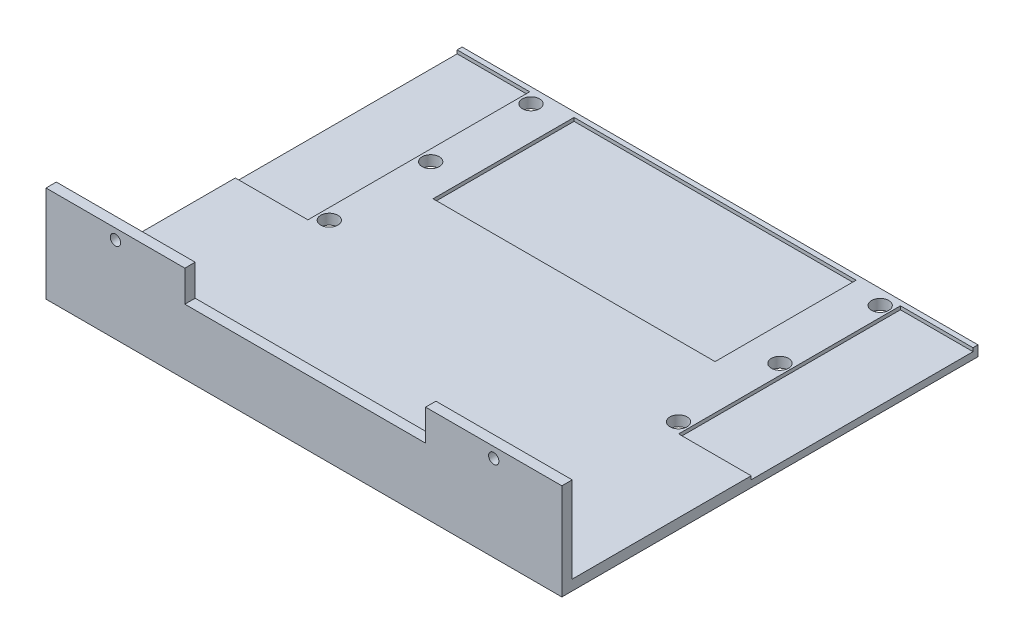
ISO-10303-21;
HEADER;
FILE_DESCRIPTION(('STEP AP214'),'2;1');
FILE_NAME('part.step','',(''),(''),'','','');
FILE_SCHEMA(('AUTOMOTIVE_DESIGN { 1 0 10303 214 1 1 1 1 }'));
ENDSEC;
DATA;
#1=APPLICATION_CONTEXT('core data for automotive mechanical design processes');
#2=APPLICATION_PROTOCOL_DEFINITION('international standard','automotive_design',2000,#1);
#3=PRODUCT_CONTEXT('',#1,'mechanical');
#4=PRODUCT('Part','Part','',(#3));
#5=PRODUCT_RELATED_PRODUCT_CATEGORY('part','',(#4));
#6=PRODUCT_DEFINITION_FORMATION('','',#4);
#7=PRODUCT_DEFINITION_CONTEXT('part definition',#1,'design');
#8=PRODUCT_DEFINITION('design','',#6,#7);
#9=PRODUCT_DEFINITION_SHAPE('','',#8);
#10=(LENGTH_UNIT() NAMED_UNIT(*) SI_UNIT(.MILLI.,.METRE.));
#11=(NAMED_UNIT(*) PLANE_ANGLE_UNIT() SI_UNIT($,.RADIAN.));
#12=(NAMED_UNIT(*) SI_UNIT($,.STERADIAN.) SOLID_ANGLE_UNIT());
#13=UNCERTAINTY_MEASURE_WITH_UNIT(LENGTH_MEASURE(1.E-05),#10,'distance_accuracy_value','');
#14=(GEOMETRIC_REPRESENTATION_CONTEXT(3) GLOBAL_UNCERTAINTY_ASSIGNED_CONTEXT((#13)) GLOBAL_UNIT_ASSIGNED_CONTEXT((#10,
#11,#12)) REPRESENTATION_CONTEXT('',''));
#15=CARTESIAN_POINT('',(0.,0.,0.));
#16=DIRECTION('',(0.,0.,1.));
#17=DIRECTION('',(1.,0.,0.));
#18=AXIS2_PLACEMENT_3D('',#15,#16,#17);
#19=CARTESIAN_POINT('',(-150.,30.9340002340272,70.2188789689777));
#20=DIRECTION('',(0.,-1.,0.));
#21=DIRECTION('',(0.,0.,-1.));
#22=AXIS2_PLACEMENT_3D('',#19,#20,#21);
#23=PLANE('',#22);
#24=DIRECTION('',(1.,0.,0.));
#25=VECTOR('',#24,1.);
#26=CARTESIAN_POINT('',(-150.,30.9340002340272,67.2188789689777));
#27=LINE('',#26,#25);
#28=CARTESIAN_POINT('',(-39.6260341679175,30.9340002340272,67.2188789689777));
#29=VERTEX_POINT('',#28);
#30=CARTESIAN_POINT('',(0.,30.9340002340272,67.2188789689777));
#31=VERTEX_POINT('',#30);
#32=EDGE_CURVE('E405',#29,#31,#27,.T.);
#33=ORIENTED_EDGE('',*,*,#32,.F.);
#34=DIRECTION('',(0.,0.,1.));
#35=VECTOR('',#34,1.);
#36=CARTESIAN_POINT('',(-39.6260341679175,30.9340002340272,67.2188789689777));
#37=LINE('',#36,#35);
#38=CARTESIAN_POINT('',(-39.6260341679175,30.9340002340272,70.2188789689777));
#39=VERTEX_POINT('',#38);
#40=EDGE_CURVE('E334',#29,#39,#37,.T.);
#41=ORIENTED_EDGE('',*,*,#40,.T.);
#42=DIRECTION('',(1.,0.,0.));
#43=VECTOR('',#42,1.);
#44=CARTESIAN_POINT('',(-150.,30.9340002340272,70.2188789689777));
#45=LINE('',#44,#43);
#46=CARTESIAN_POINT('',(0.,30.9340002340272,70.2188789689777));
#47=VERTEX_POINT('',#46);
#48=EDGE_CURVE('E410',#39,#47,#45,.T.);
#49=ORIENTED_EDGE('',*,*,#48,.T.);
#50=DIRECTION('',(0.,0.,-1.));
#51=VECTOR('',#50,1.);
#52=CARTESIAN_POINT('',(0.,30.9340002340272,70.2188789689777));
#53=LINE('',#52,#51);
#54=EDGE_CURVE('E395',#47,#31,#53,.T.);
#55=ORIENTED_EDGE('',*,*,#54,.T.);
#56=EDGE_LOOP('',(#33,#41,#49,#55));
#57=FACE_BOUND('',#56,.T.);
#58=ADVANCED_FACE('F39',(#57),#23,.F.);
#59=CARTESIAN_POINT('',(-150.,5.93400023402718,67.2188789689777));
#60=DIRECTION('',(0.,-1.,0.));
#61=DIRECTION('',(0.,0.,-1.));
#62=AXIS2_PLACEMENT_3D('',#59,#60,#61);
#63=PLANE('',#62);
#64=CARTESIAN_POINT('',(-24.1434377354213,5.93400023402718,-46.4824812406044));
#65=DIRECTION('',(0.,1.,0.));
#66=DIRECTION('',(0.,0.,1.));
#67=AXIS2_PLACEMENT_3D('',#64,#65,#66);
#68=CIRCLE('',#67,2.5);
#69=CARTESIAN_POINT('',(-24.1434377354213,5.93400023402718,-43.9824812406044));
#70=VERTEX_POINT('',#69);
#71=EDGE_CURVE('E818',#70,#70,#68,.T.);
#72=ORIENTED_EDGE('',*,*,#71,.F.);
#73=EDGE_LOOP('',(#72));
#74=FACE_BOUND('',#73,.T.);
#75=CARTESIAN_POINT('',(-24.1434377354213,5.93400023402718,-17.3290379042217));
#76=DIRECTION('',(0.,1.,0.));
#77=DIRECTION('',(0.,0.,1.));
#78=AXIS2_PLACEMENT_3D('',#75,#76,#77);
#79=CIRCLE('',#78,2.5);
#80=CARTESIAN_POINT('',(-24.1434377354213,5.93400023402718,-14.8290379042217));
#81=VERTEX_POINT('',#80);
#82=EDGE_CURVE('E826',#81,#81,#79,.T.);
#83=ORIENTED_EDGE('',*,*,#82,.F.);
#84=EDGE_LOOP('',(#83));
#85=FACE_BOUND('',#84,.T.);
#86=CARTESIAN_POINT('',(-125.694598690488,5.93400023402718,-17.3290379042217));
#87=DIRECTION('',(0.,1.,0.));
#88=DIRECTION('',(0.,0.,1.));
#89=AXIS2_PLACEMENT_3D('',#86,#87,#88);
#90=CIRCLE('',#89,2.5);
#91=CARTESIAN_POINT('',(-125.694598690488,5.93400023402718,-14.8290379042217));
#92=VERTEX_POINT('',#91);
#93=EDGE_CURVE('E834',#92,#92,#90,.T.);
#94=ORIENTED_EDGE('',*,*,#93,.F.);
#95=EDGE_LOOP('',(#94));
#96=FACE_BOUND('',#95,.T.);
#97=CARTESIAN_POINT('',(-125.694598690488,5.93400023402718,12.148332580343));
#98=DIRECTION('',(0.,1.,0.));
#99=DIRECTION('',(0.,0.,1.));
#100=AXIS2_PLACEMENT_3D('',#97,#98,#99);
#101=CIRCLE('',#100,2.5);
#102=CARTESIAN_POINT('',(-125.694598690488,5.93400023402718,14.648332580343));
#103=VERTEX_POINT('',#102);
#104=EDGE_CURVE('E810',#103,#103,#101,.T.);
#105=ORIENTED_EDGE('',*,*,#104,.F.);
#106=EDGE_LOOP('',(#105));
#107=FACE_BOUND('',#106,.T.);
#108=CARTESIAN_POINT('',(-125.694598690488,5.93400023402718,-46.4824812406044));
#109=DIRECTION('',(0.,1.,0.));
#110=DIRECTION('',(0.,0.,1.));
#111=AXIS2_PLACEMENT_3D('',#108,#109,#110);
#112=CIRCLE('',#111,2.5);
#113=CARTESIAN_POINT('',(-125.694598690488,5.93400023402718,-43.9824812406044));
#114=VERTEX_POINT('',#113);
#115=EDGE_CURVE('E797',#114,#114,#112,.T.);
#116=ORIENTED_EDGE('',*,*,#115,.F.);
#117=EDGE_LOOP('',(#116));
#118=FACE_BOUND('',#117,.T.);
#119=CARTESIAN_POINT('',(-24.1434377354213,5.93400023402718,12.148332580343));
#120=DIRECTION('',(0.,1.,0.));
#121=DIRECTION('',(0.,0.,1.));
#122=AXIS2_PLACEMENT_3D('',#119,#120,#121);
#123=CIRCLE('',#122,2.5);
#124=CARTESIAN_POINT('',(-24.1434377354213,5.93400023402718,14.648332580343));
#125=VERTEX_POINT('',#124);
#126=EDGE_CURVE('E221',#125,#125,#123,.T.);
#127=ORIENTED_EDGE('',*,*,#126,.F.);
#128=EDGE_LOOP('',(#127));
#129=FACE_BOUND('',#128,.T.);
#130=DIRECTION('',(-1.,0.,0.));
#131=VECTOR('',#130,1.);
#132=CARTESIAN_POINT('',(-116.,5.93400023402718,-49.3311210310222));
#133=LINE('',#132,#131);
#134=CARTESIAN_POINT('',(-34.,5.93400023402718,-49.3311210310223));
#135=VERTEX_POINT('',#134);
#136=CARTESIAN_POINT('',(-116.,5.93400023402718,-49.3311210310222));
#137=VERTEX_POINT('',#136);
#138=EDGE_CURVE('E230',#135,#137,#133,.T.);
#139=ORIENTED_EDGE('',*,*,#138,.F.);
#140=DIRECTION('',(0.,0.,-1.));
#141=VECTOR('',#140,1.);
#142=CARTESIAN_POINT('',(-34.,5.93400023402718,-8.33112103102224));
#143=LINE('',#142,#141);
#144=CARTESIAN_POINT('',(-34.,5.93400023402718,-8.33112103102224));
#145=VERTEX_POINT('',#144);
#146=EDGE_CURVE('E55',#145,#135,#143,.T.);
#147=ORIENTED_EDGE('',*,*,#146,.F.);
#148=DIRECTION('',(1.,0.,0.));
#149=VECTOR('',#148,1.);
#150=CARTESIAN_POINT('',(-116.,5.93400023402718,-8.33112103102224));
#151=LINE('',#150,#149);
#152=CARTESIAN_POINT('',(-116.,5.93400023402718,-8.33112103102224));
#153=VERTEX_POINT('',#152);
#154=EDGE_CURVE('E214',#153,#145,#151,.T.);
#155=ORIENTED_EDGE('',*,*,#154,.F.);
#156=DIRECTION('',(0.,0.,1.));
#157=VECTOR('',#156,1.);
#158=CARTESIAN_POINT('',(-116.,5.93400023402718,-49.3311210310222));
#159=LINE('',#158,#157);
#160=EDGE_CURVE('E218',#137,#153,#159,.T.);
#161=ORIENTED_EDGE('',*,*,#160,.F.);
#162=EDGE_LOOP('',(#139,#147,#155,#161));
#163=FACE_BOUND('',#162,.T.);
#164=DIRECTION('',(0.,0.,-1.));
#165=VECTOR('',#164,1.);
#166=CARTESIAN_POINT('',(-150.,5.93400023402718,67.2188789689777));
#167=LINE('',#166,#165);
#168=CARTESIAN_POINT('',(-150.,5.93400023402718,-49.3311210310222));
#169=VERTEX_POINT('',#168);
#170=CARTESIAN_POINT('',(-150.,5.93400023402718,-50.7811210310223));
#171=VERTEX_POINT('',#170);
#172=EDGE_CURVE('E362',#169,#171,#167,.T.);
#173=ORIENTED_EDGE('',*,*,#172,.F.);
#174=DIRECTION('',(-1.,0.,0.));
#175=VECTOR('',#174,1.);
#176=CARTESIAN_POINT('',(-128.9,5.93400023402718,-49.3311210310222));
#177=LINE('',#176,#175);
#178=CARTESIAN_POINT('',(-128.9,5.93400023402718,-49.3311210310222));
#179=VERTEX_POINT('',#178);
#180=EDGE_CURVE('E260',#179,#169,#177,.T.);
#181=ORIENTED_EDGE('',*,*,#180,.F.);
#182=DIRECTION('',(0.,0.,-1.));
#183=VECTOR('',#182,1.);
#184=CARTESIAN_POINT('',(-128.9,5.93400023402718,15.1688789689778));
#185=LINE('',#184,#183);
#186=CARTESIAN_POINT('',(-128.9,5.93400023402718,15.1688789689778));
#187=VERTEX_POINT('',#186);
#188=EDGE_CURVE('E249',#187,#179,#185,.T.);
#189=ORIENTED_EDGE('',*,*,#188,.F.);
#190=DIRECTION('',(1.,0.,0.));
#191=VECTOR('',#190,1.);
#192=CARTESIAN_POINT('',(-150.,5.93400023402718,15.1688789689778));
#193=LINE('',#192,#191);
#194=CARTESIAN_POINT('',(-150.,5.93400023402718,15.1688789689778));
#195=VERTEX_POINT('',#194);
#196=EDGE_CURVE('E263',#195,#187,#193,.T.);
#197=ORIENTED_EDGE('',*,*,#196,.F.);
#198=CARTESIAN_POINT('',(-150.,5.93400023402718,67.2188789689777));
#199=VERTEX_POINT('',#198);
#200=EDGE_CURVE('E357',#199,#195,#167,.T.);
#201=ORIENTED_EDGE('',*,*,#200,.F.);
#202=DIRECTION('',(1.,0.,0.));
#203=VECTOR('',#202,1.);
#204=CARTESIAN_POINT('',(-150.,5.93400023402718,67.2188789689777));
#205=LINE('',#204,#203);
#206=CARTESIAN_POINT('',(0.,5.93400023402718,67.2188789689777));
#207=VERTEX_POINT('',#206);
#208=EDGE_CURVE('E378',#199,#207,#205,.T.);
#209=ORIENTED_EDGE('',*,*,#208,.T.);
#210=DIRECTION('',(0.,0.,-1.));
#211=VECTOR('',#210,1.);
#212=CARTESIAN_POINT('',(0.,5.93400023402718,67.2188789689777));
#213=LINE('',#212,#211);
#214=CARTESIAN_POINT('',(0.,5.93400023402718,15.1688789689778));
#215=VERTEX_POINT('',#214);
#216=EDGE_CURVE('E379',#207,#215,#213,.T.);
#217=ORIENTED_EDGE('',*,*,#216,.T.);
#218=DIRECTION('',(1.,0.,0.));
#219=VECTOR('',#218,1.);
#220=CARTESIAN_POINT('',(-21.1,5.93400023402718,15.1688789689778));
#221=LINE('',#220,#219);
#222=CARTESIAN_POINT('',(-21.1,5.93400023402718,15.1688789689778));
#223=VERTEX_POINT('',#222);
#224=EDGE_CURVE('E240',#223,#215,#221,.T.);
#225=ORIENTED_EDGE('',*,*,#224,.F.);
#226=DIRECTION('',(0.,0.,1.));
#227=VECTOR('',#226,1.);
#228=CARTESIAN_POINT('',(-21.1,5.93400023402718,-49.3311210310223));
#229=LINE('',#228,#227);
#230=CARTESIAN_POINT('',(-21.1,5.93400023402718,-49.3311210310223));
#231=VERTEX_POINT('',#230);
#232=EDGE_CURVE('E288',#231,#223,#229,.T.);
#233=ORIENTED_EDGE('',*,*,#232,.F.);
#234=DIRECTION('',(-1.,0.,0.));
#235=VECTOR('',#234,1.);
#236=CARTESIAN_POINT('',(0.,5.93400023402718,-49.3311210310222));
#237=LINE('',#236,#235);
#238=CARTESIAN_POINT('',(0.,5.93400023402718,-49.3311210310222));
#239=VERTEX_POINT('',#238);
#240=EDGE_CURVE('E303',#239,#231,#237,.T.);
#241=ORIENTED_EDGE('',*,*,#240,.F.);
#242=CARTESIAN_POINT('',(0.,5.93400023402718,-50.7811210310223));
#243=VERTEX_POINT('',#242);
#244=EDGE_CURVE('E347',#239,#243,#213,.T.);
#245=ORIENTED_EDGE('',*,*,#244,.T.);
#246=DIRECTION('',(1.,0.,0.));
#247=VECTOR('',#246,1.);
#248=CARTESIAN_POINT('',(-150.,5.93400023402718,-50.7811210310223));
#249=LINE('',#248,#247);
#250=EDGE_CURVE('E11',#171,#243,#249,.T.);
#251=ORIENTED_EDGE('',*,*,#250,.F.);
#252=EDGE_LOOP('',(#173,#181,#189,#197,#201,#209,#217,#225,#233,#241,#245,#251));
#253=FACE_BOUND('',#252,.T.);
#254=ADVANCED_FACE('F41',(#74,#85,#96,#107,#118,#129,#163,#253),#63,.F.);
#255=CARTESIAN_POINT('',(-150.,5.93400023402718,-50.7811210310223));
#256=DIRECTION('',(0.,0.,1.));
#257=DIRECTION('',(1.,0.,0.));
#258=AXIS2_PLACEMENT_3D('',#255,#256,#257);
#259=PLANE('',#258);
#260=DIRECTION('',(0.,-1.,0.));
#261=VECTOR('',#260,1.);
#262=CARTESIAN_POINT('',(0.,5.93400023402718,-50.7811210310223));
#263=LINE('',#262,#261);
#264=CARTESIAN_POINT('',(0.,2.93400023402718,-50.7811210310223));
#265=VERTEX_POINT('',#264);
#266=EDGE_CURVE('E383',#243,#265,#263,.T.);
#267=ORIENTED_EDGE('',*,*,#266,.T.);
#268=DIRECTION('',(1.,0.,0.));
#269=VECTOR('',#268,1.);
#270=CARTESIAN_POINT('',(-150.,2.93400023402718,-50.7811210310223));
#271=LINE('',#270,#269);
#272=CARTESIAN_POINT('',(-150.,2.93400023402718,-50.7811210310223));
#273=VERTEX_POINT('',#272);
#274=EDGE_CURVE('E48',#273,#265,#271,.T.);
#275=ORIENTED_EDGE('',*,*,#274,.F.);
#276=DIRECTION('',(0.,-1.,0.));
#277=VECTOR('',#276,1.);
#278=CARTESIAN_POINT('',(-150.,5.93400023402718,-50.7811210310223));
#279=LINE('',#278,#277);
#280=EDGE_CURVE('E361',#171,#273,#279,.T.);
#281=ORIENTED_EDGE('',*,*,#280,.F.);
#282=ORIENTED_EDGE('',*,*,#250,.T.);
#283=EDGE_LOOP('',(#267,#275,#281,#282));
#284=FACE_BOUND('',#283,.T.);
#285=ADVANCED_FACE('F426',(#284),#259,.F.);
#286=CARTESIAN_POINT('',(-150.,2.93400023402718,70.2188789689777));
#287=DIRECTION('',(0.,-1.,0.));
#288=DIRECTION('',(0.,0.,-1.));
#289=AXIS2_PLACEMENT_3D('',#286,#287,#288);
#290=PLANE('',#289);
#291=CARTESIAN_POINT('',(-24.1434377354213,2.93400023402718,-46.4824812406044));
#292=DIRECTION('',(0.,1.,0.));
#293=DIRECTION('',(0.,0.,1.));
#294=AXIS2_PLACEMENT_3D('',#291,#292,#293);
#295=CIRCLE('',#294,2.5);
#296=CARTESIAN_POINT('',(-24.1434377354213,2.93400023402718,-43.9824812406044));
#297=VERTEX_POINT('',#296);
#298=EDGE_CURVE('E814',#297,#297,#295,.T.);
#299=ORIENTED_EDGE('',*,*,#298,.T.);
#300=EDGE_LOOP('',(#299));
#301=FACE_BOUND('',#300,.T.);
#302=CARTESIAN_POINT('',(-24.1434377354213,2.93400023402718,-17.3290379042217));
#303=DIRECTION('',(0.,1.,0.));
#304=DIRECTION('',(0.,0.,1.));
#305=AXIS2_PLACEMENT_3D('',#302,#303,#304);
#306=CIRCLE('',#305,2.5);
#307=CARTESIAN_POINT('',(-24.1434377354213,2.93400023402718,-14.8290379042217));
#308=VERTEX_POINT('',#307);
#309=EDGE_CURVE('E822',#308,#308,#306,.T.);
#310=ORIENTED_EDGE('',*,*,#309,.T.);
#311=EDGE_LOOP('',(#310));
#312=FACE_BOUND('',#311,.T.);
#313=CARTESIAN_POINT('',(-125.694598690488,2.93400023402718,-17.3290379042217));
#314=DIRECTION('',(0.,1.,0.));
#315=DIRECTION('',(0.,0.,1.));
#316=AXIS2_PLACEMENT_3D('',#313,#314,#315);
#317=CIRCLE('',#316,2.5);
#318=CARTESIAN_POINT('',(-125.694598690488,2.93400023402718,-14.8290379042217));
#319=VERTEX_POINT('',#318);
#320=EDGE_CURVE('E830',#319,#319,#317,.T.);
#321=ORIENTED_EDGE('',*,*,#320,.T.);
#322=EDGE_LOOP('',(#321));
#323=FACE_BOUND('',#322,.T.);
#324=CARTESIAN_POINT('',(-125.694598690488,2.93400023402718,12.148332580343));
#325=DIRECTION('',(0.,1.,0.));
#326=DIRECTION('',(0.,0.,1.));
#327=AXIS2_PLACEMENT_3D('',#324,#325,#326);
#328=CIRCLE('',#327,2.5);
#329=CARTESIAN_POINT('',(-125.694598690488,2.93400023402718,14.648332580343));
#330=VERTEX_POINT('',#329);
#331=EDGE_CURVE('E838',#330,#330,#328,.T.);
#332=ORIENTED_EDGE('',*,*,#331,.T.);
#333=EDGE_LOOP('',(#332));
#334=FACE_BOUND('',#333,.T.);
#335=CARTESIAN_POINT('',(-125.694598690488,2.93400023402718,-46.4824812406044));
#336=DIRECTION('',(0.,1.,0.));
#337=DIRECTION('',(0.,0.,1.));
#338=AXIS2_PLACEMENT_3D('',#335,#336,#337);
#339=CIRCLE('',#338,2.5);
#340=CARTESIAN_POINT('',(-125.694598690488,2.93400023402718,-43.9824812406044));
#341=VERTEX_POINT('',#340);
#342=EDGE_CURVE('E806',#341,#341,#339,.T.);
#343=ORIENTED_EDGE('',*,*,#342,.T.);
#344=EDGE_LOOP('',(#343));
#345=FACE_BOUND('',#344,.T.);
#346=CARTESIAN_POINT('',(-24.1434377354213,2.93400023402718,12.148332580343));
#347=DIRECTION('',(0.,1.,0.));
#348=DIRECTION('',(0.,0.,1.));
#349=AXIS2_PLACEMENT_3D('',#346,#347,#348);
#350=CIRCLE('',#349,2.5);
#351=CARTESIAN_POINT('',(-24.1434377354213,2.93400023402718,14.648332580343));
#352=VERTEX_POINT('',#351);
#353=EDGE_CURVE('E231',#352,#352,#350,.T.);
#354=ORIENTED_EDGE('',*,*,#353,.T.);
#355=EDGE_LOOP('',(#354));
#356=FACE_BOUND('',#355,.T.);
#357=DIRECTION('',(0.,0.,-1.));
#358=VECTOR('',#357,1.);
#359=CARTESIAN_POINT('',(0.,2.93400023402718,70.2188789689777));
#360=LINE('',#359,#358);
#361=CARTESIAN_POINT('',(0.,2.93400023402718,70.2188789689777));
#362=VERTEX_POINT('',#361);
#363=EDGE_CURVE('E387',#362,#265,#360,.T.);
#364=ORIENTED_EDGE('',*,*,#363,.F.);
#365=DIRECTION('',(1.,0.,0.));
#366=VECTOR('',#365,1.);
#367=CARTESIAN_POINT('',(-150.,2.93400023402718,70.2188789689777));
#368=LINE('',#367,#366);
#369=CARTESIAN_POINT('',(-150.,2.93400023402718,70.2188789689777));
#370=VERTEX_POINT('',#369);
#371=EDGE_CURVE('E415',#370,#362,#368,.T.);
#372=ORIENTED_EDGE('',*,*,#371,.F.);
#373=DIRECTION('',(0.,0.,-1.));
#374=VECTOR('',#373,1.);
#375=CARTESIAN_POINT('',(-150.,2.93400023402718,70.2188789689777));
#376=LINE('',#375,#374);
#377=EDGE_CURVE('E365',#370,#273,#376,.T.);
#378=ORIENTED_EDGE('',*,*,#377,.T.);
#379=ORIENTED_EDGE('',*,*,#274,.T.);
#380=EDGE_LOOP('',(#364,#372,#378,#379));
#381=FACE_BOUND('',#380,.T.);
#382=ADVANCED_FACE('F421',(#301,#312,#323,#334,#345,#356,#381),#290,.T.);
#383=CARTESIAN_POINT('',(-150.,2.93400023402718,70.2188789689777));
#384=DIRECTION('',(0.,0.,-1.));
#385=DIRECTION('',(-1.,0.,0.));
#386=AXIS2_PLACEMENT_3D('',#383,#384,#385);
#387=PLANE('',#386);
#388=CARTESIAN_POINT('',(-129.813017083959,27.9340002340272,70.2188789689777));
#389=DIRECTION('',(0.,0.,1.));
#390=DIRECTION('',(1.,0.,0.));
#391=AXIS2_PLACEMENT_3D('',#388,#389,#390);
#392=CIRCLE('',#391,1.5);
#393=CARTESIAN_POINT('',(-128.313017083959,27.9340002340272,70.2188789689777));
#394=VERTEX_POINT('',#393);
#395=EDGE_CURVE('E791',#394,#394,#392,.T.);
#396=ORIENTED_EDGE('',*,*,#395,.F.);
#397=EDGE_LOOP('',(#396));
#398=FACE_BOUND('',#397,.T.);
#399=CARTESIAN_POINT('',(-19.8130170839587,27.9340002340272,70.2188789689777));
#400=DIRECTION('',(0.,0.,1.));
#401=DIRECTION('',(1.,0.,0.));
#402=AXIS2_PLACEMENT_3D('',#399,#400,#401);
#403=CIRCLE('',#402,1.5);
#404=CARTESIAN_POINT('',(-18.3130170839587,27.9340002340272,70.2188789689777));
#405=VERTEX_POINT('',#404);
#406=EDGE_CURVE('E800',#405,#405,#403,.T.);
#407=ORIENTED_EDGE('',*,*,#406,.F.);
#408=EDGE_LOOP('',(#407));
#409=FACE_BOUND('',#408,.T.);
#410=ORIENTED_EDGE('',*,*,#48,.F.);
#411=DIRECTION('',(0.,1.,0.));
#412=VECTOR('',#411,1.);
#413=CARTESIAN_POINT('',(-39.6260341679175,21.8563470512623,70.2188789689777));
#414=LINE('',#413,#412);
#415=CARTESIAN_POINT('',(-39.6260341679175,21.8563470512623,70.2188789689777));
#416=VERTEX_POINT('',#415);
#417=EDGE_CURVE('E274',#416,#39,#414,.T.);
#418=ORIENTED_EDGE('',*,*,#417,.F.);
#419=DIRECTION('',(1.,0.,0.));
#420=VECTOR('',#419,1.);
#421=CARTESIAN_POINT('',(-109.626034167917,21.8563470512623,70.2188789689777));
#422=LINE('',#421,#420);
#423=CARTESIAN_POINT('',(-109.626034167917,21.8563470512623,70.2188789689777));
#424=VERTEX_POINT('',#423);
#425=EDGE_CURVE('E326',#424,#416,#422,.T.);
#426=ORIENTED_EDGE('',*,*,#425,.F.);
#427=DIRECTION('',(0.,-1.,0.));
#428=VECTOR('',#427,1.);
#429=CARTESIAN_POINT('',(-109.626034167917,30.9340002340272,70.2188789689777));
#430=LINE('',#429,#428);
#431=CARTESIAN_POINT('',(-109.626034167917,30.9340002340272,70.2188789689777));
#432=VERTEX_POINT('',#431);
#433=EDGE_CURVE('E337',#432,#424,#430,.T.);
#434=ORIENTED_EDGE('',*,*,#433,.F.);
#435=CARTESIAN_POINT('',(-150.,30.9340002340272,70.2188789689777));
#436=VERTEX_POINT('',#435);
#437=EDGE_CURVE('E411',#436,#432,#45,.T.);
#438=ORIENTED_EDGE('',*,*,#437,.F.);
#439=DIRECTION('',(0.,1.,0.));
#440=VECTOR('',#439,1.);
#441=CARTESIAN_POINT('',(-150.,2.93400023402718,70.2188789689777));
#442=LINE('',#441,#440);
#443=EDGE_CURVE('E369',#370,#436,#442,.T.);
#444=ORIENTED_EDGE('',*,*,#443,.F.);
#445=ORIENTED_EDGE('',*,*,#371,.T.);
#446=DIRECTION('',(0.,1.,0.));
#447=VECTOR('',#446,1.);
#448=CARTESIAN_POINT('',(0.,2.93400023402718,70.2188789689777));
#449=LINE('',#448,#447);
#450=EDGE_CURVE('E391',#362,#47,#449,.T.);
#451=ORIENTED_EDGE('',*,*,#450,.T.);
#452=EDGE_LOOP('',(#410,#418,#426,#434,#438,#444,#445,#451));
#453=FACE_BOUND('',#452,.T.);
#454=ADVANCED_FACE('F437',(#398,#409,#453),#387,.F.);
#455=ORIENTED_EDGE('',*,*,#437,.T.);
#456=DIRECTION('',(0.,0.,1.));
#457=VECTOR('',#456,1.);
#458=CARTESIAN_POINT('',(-109.626034167917,30.9340002340272,67.2188789689777));
#459=LINE('',#458,#457);
#460=CARTESIAN_POINT('',(-109.626034167917,30.9340002340272,67.2188789689777));
#461=VERTEX_POINT('',#460);
#462=EDGE_CURVE('E351',#461,#432,#459,.T.);
#463=ORIENTED_EDGE('',*,*,#462,.F.);
#464=CARTESIAN_POINT('',(-150.,30.9340002340272,67.2188789689777));
#465=VERTEX_POINT('',#464);
#466=EDGE_CURVE('E406',#465,#461,#27,.T.);
#467=ORIENTED_EDGE('',*,*,#466,.F.);
#468=DIRECTION('',(0.,0.,-1.));
#469=VECTOR('',#468,1.);
#470=CARTESIAN_POINT('',(-150.,30.9340002340272,70.2188789689777));
#471=LINE('',#470,#469);
#472=EDGE_CURVE('E372',#436,#465,#471,.T.);
#473=ORIENTED_EDGE('',*,*,#472,.F.);
#474=EDGE_LOOP('',(#455,#463,#467,#473));
#475=FACE_BOUND('',#474,.T.);
#476=ADVANCED_FACE('F470',(#475),#23,.F.);
#477=CARTESIAN_POINT('',(-150.,30.9340002340272,67.2188789689777));
#478=DIRECTION('',(0.,0.,1.));
#479=DIRECTION('',(1.,0.,0.));
#480=AXIS2_PLACEMENT_3D('',#477,#478,#479);
#481=PLANE('',#480);
#482=CARTESIAN_POINT('',(-129.813017083959,27.9340002340272,67.2188789689777));
#483=DIRECTION('',(0.,0.,1.));
#484=DIRECTION('',(1.,0.,0.));
#485=AXIS2_PLACEMENT_3D('',#482,#483,#484);
#486=CIRCLE('',#485,1.5);
#487=CARTESIAN_POINT('',(-128.313017083959,27.9340002340272,67.2188789689777));
#488=VERTEX_POINT('',#487);
#489=EDGE_CURVE('E789',#488,#488,#486,.T.);
#490=ORIENTED_EDGE('',*,*,#489,.T.);
#491=EDGE_LOOP('',(#490));
#492=FACE_BOUND('',#491,.T.);
#493=CARTESIAN_POINT('',(-19.8130170839587,27.9340002340272,67.2188789689777));
#494=DIRECTION('',(0.,0.,1.));
#495=DIRECTION('',(1.,0.,0.));
#496=AXIS2_PLACEMENT_3D('',#493,#494,#495);
#497=CIRCLE('',#496,1.5);
#498=CARTESIAN_POINT('',(-18.3130170839587,27.9340002340272,67.2188789689777));
#499=VERTEX_POINT('',#498);
#500=EDGE_CURVE('E793',#499,#499,#497,.T.);
#501=ORIENTED_EDGE('',*,*,#500,.T.);
#502=EDGE_LOOP('',(#501));
#503=FACE_BOUND('',#502,.T.);
#504=DIRECTION('',(1.,0.,0.));
#505=VECTOR('',#504,1.);
#506=CARTESIAN_POINT('',(-109.626034167917,21.8563470512623,67.2188789689777));
#507=LINE('',#506,#505);
#508=CARTESIAN_POINT('',(-109.626034167917,21.8563470512623,67.2188789689777));
#509=VERTEX_POINT('',#508);
#510=CARTESIAN_POINT('',(-39.6260341679175,21.8563470512623,67.2188789689777));
#511=VERTEX_POINT('',#510);
#512=EDGE_CURVE('E330',#509,#511,#507,.T.);
#513=ORIENTED_EDGE('',*,*,#512,.T.);
#514=DIRECTION('',(0.,1.,0.));
#515=VECTOR('',#514,1.);
#516=CARTESIAN_POINT('',(-39.6260341679175,21.8563470512623,67.2188789689777));
#517=LINE('',#516,#515);
#518=EDGE_CURVE('E321',#511,#29,#517,.T.);
#519=ORIENTED_EDGE('',*,*,#518,.T.);
#520=ORIENTED_EDGE('',*,*,#32,.T.);
#521=DIRECTION('',(0.,-1.,0.));
#522=VECTOR('',#521,1.);
#523=CARTESIAN_POINT('',(0.,30.9340002340272,67.2188789689777));
#524=LINE('',#523,#522);
#525=EDGE_CURVE('E399',#31,#207,#524,.T.);
#526=ORIENTED_EDGE('',*,*,#525,.T.);
#527=ORIENTED_EDGE('',*,*,#208,.F.);
#528=DIRECTION('',(0.,-1.,0.));
#529=VECTOR('',#528,1.);
#530=CARTESIAN_POINT('',(-150.,30.9340002340272,67.2188789689777));
#531=LINE('',#530,#529);
#532=EDGE_CURVE('E375',#465,#199,#531,.T.);
#533=ORIENTED_EDGE('',*,*,#532,.F.);
#534=ORIENTED_EDGE('',*,*,#466,.T.);
#535=DIRECTION('',(0.,-1.,0.));
#536=VECTOR('',#535,1.);
#537=CARTESIAN_POINT('',(-109.626034167917,30.9340002340272,67.2188789689777));
#538=LINE('',#537,#536);
#539=EDGE_CURVE('E325',#461,#509,#538,.T.);
#540=ORIENTED_EDGE('',*,*,#539,.T.);
#541=EDGE_LOOP('',(#513,#519,#520,#526,#527,#533,#534,#540));
#542=FACE_BOUND('',#541,.T.);
#543=ADVANCED_FACE('F461',(#492,#503,#542),#481,.F.);
#544=CARTESIAN_POINT('',(-150.,0.,0.));
#545=DIRECTION('',(-1.,0.,0.));
#546=DIRECTION('',(0.,0.,1.));
#547=AXIS2_PLACEMENT_3D('',#544,#545,#546);
#548=PLANE('',#547);
#549=DIRECTION('',(0.,1.,0.));
#550=VECTOR('',#549,1.);
#551=CARTESIAN_POINT('',(-150.,4.93400023402718,-49.3311210310222));
#552=LINE('',#551,#550);
#553=CARTESIAN_POINT('',(-150.,4.93400023402718,-49.3311210310222));
#554=VERTEX_POINT('',#553);
#555=EDGE_CURVE('E259',#554,#169,#552,.T.);
#556=ORIENTED_EDGE('',*,*,#555,.T.);
#557=ORIENTED_EDGE('',*,*,#172,.T.);
#558=ORIENTED_EDGE('',*,*,#280,.T.);
#559=ORIENTED_EDGE('',*,*,#377,.F.);
#560=ORIENTED_EDGE('',*,*,#443,.T.);
#561=ORIENTED_EDGE('',*,*,#472,.T.);
#562=ORIENTED_EDGE('',*,*,#532,.T.);
#563=ORIENTED_EDGE('',*,*,#200,.T.);
#564=DIRECTION('',(0.,1.,0.));
#565=VECTOR('',#564,1.);
#566=CARTESIAN_POINT('',(-150.,4.93400023402718,15.1688789689778));
#567=LINE('',#566,#565);
#568=CARTESIAN_POINT('',(-150.,4.93400023402718,15.1688789689778));
#569=VERTEX_POINT('',#568);
#570=EDGE_CURVE('E278',#569,#195,#567,.T.);
#571=ORIENTED_EDGE('',*,*,#570,.F.);
#572=DIRECTION('',(0.,0.,1.));
#573=VECTOR('',#572,1.);
#574=CARTESIAN_POINT('',(-150.,4.93400023402718,-49.3311210310222));
#575=LINE('',#574,#573);
#576=EDGE_CURVE('E248',#554,#569,#575,.T.);
#577=ORIENTED_EDGE('',*,*,#576,.F.);
#578=EDGE_LOOP('',(#556,#557,#558,#559,#560,#561,#562,#563,#571,#577));
#579=FACE_BOUND('',#578,.T.);
#580=ADVANCED_FACE('F444',(#579),#548,.T.);
#581=CARTESIAN_POINT('',(0.,0.,0.));
#582=DIRECTION('',(-1.,0.,0.));
#583=DIRECTION('',(0.,0.,1.));
#584=AXIS2_PLACEMENT_3D('',#581,#582,#583);
#585=PLANE('',#584);
#586=DIRECTION('',(0.,0.,-1.));
#587=VECTOR('',#586,1.);
#588=CARTESIAN_POINT('',(0.,4.93400023402718,-49.3311210310222));
#589=LINE('',#588,#587);
#590=CARTESIAN_POINT('',(0.,4.93400023402718,15.1688789689778));
#591=VERTEX_POINT('',#590);
#592=CARTESIAN_POINT('',(0.,4.93400023402718,-49.3311210310222));
#593=VERTEX_POINT('',#592);
#594=EDGE_CURVE('E287',#591,#593,#589,.T.);
#595=ORIENTED_EDGE('',*,*,#594,.F.);
#596=DIRECTION('',(0.,1.,0.));
#597=VECTOR('',#596,1.);
#598=CARTESIAN_POINT('',(0.,4.93400023402718,15.1688789689778));
#599=LINE('',#598,#597);
#600=EDGE_CURVE('E300',#591,#215,#599,.T.);
#601=ORIENTED_EDGE('',*,*,#600,.T.);
#602=ORIENTED_EDGE('',*,*,#216,.F.);
#603=ORIENTED_EDGE('',*,*,#525,.F.);
#604=ORIENTED_EDGE('',*,*,#54,.F.);
#605=ORIENTED_EDGE('',*,*,#450,.F.);
#606=ORIENTED_EDGE('',*,*,#363,.T.);
#607=ORIENTED_EDGE('',*,*,#266,.F.);
#608=ORIENTED_EDGE('',*,*,#244,.F.);
#609=DIRECTION('',(0.,1.,0.));
#610=VECTOR('',#609,1.);
#611=CARTESIAN_POINT('',(0.,4.93400023402718,-49.3311210310222));
#612=LINE('',#611,#610);
#613=EDGE_CURVE('E315',#593,#239,#612,.T.);
#614=ORIENTED_EDGE('',*,*,#613,.F.);
#615=EDGE_LOOP('',(#595,#601,#602,#603,#604,#605,#606,#607,#608,#614));
#616=FACE_BOUND('',#615,.T.);
#617=ADVANCED_FACE('F432',(#616),#585,.F.);
#618=CARTESIAN_POINT('',(-39.6260341679175,21.8563470512623,67.2188789689777));
#619=DIRECTION('',(1.,0.,0.));
#620=DIRECTION('',(0.,0.,-1.));
#621=AXIS2_PLACEMENT_3D('',#618,#619,#620);
#622=PLANE('',#621);
#623=ORIENTED_EDGE('',*,*,#417,.T.);
#624=ORIENTED_EDGE('',*,*,#40,.F.);
#625=ORIENTED_EDGE('',*,*,#518,.F.);
#626=DIRECTION('',(0.,0.,1.));
#627=VECTOR('',#626,1.);
#628=CARTESIAN_POINT('',(-39.6260341679175,21.8563470512623,67.2188789689777));
#629=LINE('',#628,#627);
#630=EDGE_CURVE('E344',#511,#416,#629,.T.);
#631=ORIENTED_EDGE('',*,*,#630,.T.);
#632=EDGE_LOOP('',(#623,#624,#625,#631));
#633=FACE_BOUND('',#632,.T.);
#634=ADVANCED_FACE('F459',(#633),#622,.F.);
#635=CARTESIAN_POINT('',(-109.626034167917,21.8563470512623,67.2188789689777));
#636=DIRECTION('',(0.,-1.,0.));
#637=DIRECTION('',(0.,0.,-1.));
#638=AXIS2_PLACEMENT_3D('',#635,#636,#637);
#639=PLANE('',#638);
#640=ORIENTED_EDGE('',*,*,#425,.T.);
#641=ORIENTED_EDGE('',*,*,#630,.F.);
#642=ORIENTED_EDGE('',*,*,#512,.F.);
#643=DIRECTION('',(0.,0.,1.));
#644=VECTOR('',#643,1.);
#645=CARTESIAN_POINT('',(-109.626034167917,21.8563470512623,67.2188789689777));
#646=LINE('',#645,#644);
#647=EDGE_CURVE('E348',#509,#424,#646,.T.);
#648=ORIENTED_EDGE('',*,*,#647,.T.);
#649=EDGE_LOOP('',(#640,#641,#642,#648));
#650=FACE_BOUND('',#649,.T.);
#651=ADVANCED_FACE('F464',(#650),#639,.F.);
#652=CARTESIAN_POINT('',(-109.626034167917,30.9340002340272,67.2188789689777));
#653=DIRECTION('',(-1.,0.,0.));
#654=DIRECTION('',(0.,0.,1.));
#655=AXIS2_PLACEMENT_3D('',#652,#653,#654);
#656=PLANE('',#655);
#657=ORIENTED_EDGE('',*,*,#433,.T.);
#658=ORIENTED_EDGE('',*,*,#647,.F.);
#659=ORIENTED_EDGE('',*,*,#539,.F.);
#660=ORIENTED_EDGE('',*,*,#462,.T.);
#661=EDGE_LOOP('',(#657,#658,#659,#660));
#662=FACE_BOUND('',#661,.T.);
#663=ADVANCED_FACE('F466',(#662),#656,.F.);
#664=CARTESIAN_POINT('',(-21.1,4.93400023402718,15.1688789689778));
#665=DIRECTION('',(0.,0.,1.));
#666=DIRECTION('',(1.,0.,0.));
#667=AXIS2_PLACEMENT_3D('',#664,#665,#666);
#668=PLANE('',#667);
#669=ORIENTED_EDGE('',*,*,#224,.T.);
#670=ORIENTED_EDGE('',*,*,#600,.F.);
#671=DIRECTION('',(1.,0.,0.));
#672=VECTOR('',#671,1.);
#673=CARTESIAN_POINT('',(-21.1,4.93400023402718,15.1688789689778));
#674=LINE('',#673,#672);
#675=CARTESIAN_POINT('',(-21.1,4.93400023402718,15.1688789689778));
#676=VERTEX_POINT('',#675);
#677=EDGE_CURVE('E284',#676,#591,#674,.T.);
#678=ORIENTED_EDGE('',*,*,#677,.F.);
#679=DIRECTION('',(0.,1.,0.));
#680=VECTOR('',#679,1.);
#681=CARTESIAN_POINT('',(-21.1,4.93400023402718,15.1688789689778));
#682=LINE('',#681,#680);
#683=EDGE_CURVE('E264',#676,#223,#682,.T.);
#684=ORIENTED_EDGE('',*,*,#683,.T.);
#685=EDGE_LOOP('',(#669,#670,#678,#684));
#686=FACE_BOUND('',#685,.T.);
#687=ADVANCED_FACE('F721',(#686),#668,.F.);
#688=CARTESIAN_POINT('',(-21.1,4.93400023402718,-49.3311210310223));
#689=DIRECTION('',(-1.,0.,0.));
#690=DIRECTION('',(0.,0.,1.));
#691=AXIS2_PLACEMENT_3D('',#688,#689,#690);
#692=PLANE('',#691);
#693=ORIENTED_EDGE('',*,*,#232,.T.);
#694=ORIENTED_EDGE('',*,*,#683,.F.);
#695=DIRECTION('',(0.,0.,1.));
#696=VECTOR('',#695,1.);
#697=CARTESIAN_POINT('',(-21.1,4.93400023402718,-49.3311210310223));
#698=LINE('',#697,#696);
#699=CARTESIAN_POINT('',(-21.1,4.93400023402718,-49.3311210310223));
#700=VERTEX_POINT('',#699);
#701=EDGE_CURVE('E296',#700,#676,#698,.T.);
#702=ORIENTED_EDGE('',*,*,#701,.F.);
#703=DIRECTION('',(0.,1.,0.));
#704=VECTOR('',#703,1.);
#705=CARTESIAN_POINT('',(-21.1,4.93400023402718,-49.3311210310223));
#706=LINE('',#705,#704);
#707=EDGE_CURVE('E312',#700,#231,#706,.T.);
#708=ORIENTED_EDGE('',*,*,#707,.T.);
#709=EDGE_LOOP('',(#693,#694,#702,#708));
#710=FACE_BOUND('',#709,.T.);
#711=ADVANCED_FACE('F712',(#710),#692,.F.);
#712=CARTESIAN_POINT('',(0.,4.93400023402718,-49.3311210310222));
#713=DIRECTION('',(0.,0.,-1.));
#714=DIRECTION('',(-1.,0.,0.));
#715=AXIS2_PLACEMENT_3D('',#712,#713,#714);
#716=PLANE('',#715);
#717=ORIENTED_EDGE('',*,*,#240,.T.);
#718=ORIENTED_EDGE('',*,*,#707,.F.);
#719=DIRECTION('',(-1.,0.,0.));
#720=VECTOR('',#719,1.);
#721=CARTESIAN_POINT('',(0.,4.93400023402718,-49.3311210310222));
#722=LINE('',#721,#720);
#723=EDGE_CURVE('E292',#593,#700,#722,.T.);
#724=ORIENTED_EDGE('',*,*,#723,.F.);
#725=ORIENTED_EDGE('',*,*,#613,.T.);
#726=EDGE_LOOP('',(#717,#718,#724,#725));
#727=FACE_BOUND('',#726,.T.);
#728=ADVANCED_FACE('F496',(#727),#716,.F.);
#729=CARTESIAN_POINT('',(0.,4.93400023402718,0.));
#730=DIRECTION('',(0.,-1.,0.));
#731=DIRECTION('',(0.,0.,-1.));
#732=AXIS2_PLACEMENT_3D('',#729,#730,#731);
#733=PLANE('',#732);
#734=ORIENTED_EDGE('',*,*,#677,.T.);
#735=ORIENTED_EDGE('',*,*,#594,.T.);
#736=ORIENTED_EDGE('',*,*,#723,.T.);
#737=ORIENTED_EDGE('',*,*,#701,.T.);
#738=EDGE_LOOP('',(#734,#735,#736,#737));
#739=FACE_BOUND('',#738,.T.);
#740=ADVANCED_FACE('F489',(#739),#733,.F.);
#741=CARTESIAN_POINT('',(-128.9,4.93400023402718,-49.3311210310222));
#742=DIRECTION('',(0.,0.,-1.));
#743=DIRECTION('',(-1.,0.,0.));
#744=AXIS2_PLACEMENT_3D('',#741,#742,#743);
#745=PLANE('',#744);
#746=ORIENTED_EDGE('',*,*,#180,.T.);
#747=ORIENTED_EDGE('',*,*,#555,.F.);
#748=DIRECTION('',(-1.,0.,0.));
#749=VECTOR('',#748,1.);
#750=CARTESIAN_POINT('',(-128.9,4.93400023402718,-49.3311210310222));
#751=LINE('',#750,#749);
#752=CARTESIAN_POINT('',(-128.9,4.93400023402718,-49.3311210310222));
#753=VERTEX_POINT('',#752);
#754=EDGE_CURVE('E63',#753,#554,#751,.T.);
#755=ORIENTED_EDGE('',*,*,#754,.F.);
#756=DIRECTION('',(0.,1.,0.));
#757=VECTOR('',#756,1.);
#758=CARTESIAN_POINT('',(-128.9,4.93400023402718,-49.3311210310222));
#759=LINE('',#758,#757);
#760=EDGE_CURVE('E271',#753,#179,#759,.T.);
#761=ORIENTED_EDGE('',*,*,#760,.T.);
#762=EDGE_LOOP('',(#746,#747,#755,#761));
#763=FACE_BOUND('',#762,.T.);
#764=ADVANCED_FACE('F487',(#763),#745,.F.);
#765=CARTESIAN_POINT('',(-128.9,4.93400023402718,15.1688789689778));
#766=DIRECTION('',(1.,0.,0.));
#767=DIRECTION('',(0.,0.,-1.));
#768=AXIS2_PLACEMENT_3D('',#765,#766,#767);
#769=PLANE('',#768);
#770=ORIENTED_EDGE('',*,*,#188,.T.);
#771=ORIENTED_EDGE('',*,*,#760,.F.);
#772=DIRECTION('',(0.,0.,-1.));
#773=VECTOR('',#772,1.);
#774=CARTESIAN_POINT('',(-128.9,4.93400023402718,15.1688789689778));
#775=LINE('',#774,#773);
#776=CARTESIAN_POINT('',(-128.9,4.93400023402718,15.1688789689778));
#777=VERTEX_POINT('',#776);
#778=EDGE_CURVE('E256',#777,#753,#775,.T.);
#779=ORIENTED_EDGE('',*,*,#778,.F.);
#780=DIRECTION('',(0.,1.,0.));
#781=VECTOR('',#780,1.);
#782=CARTESIAN_POINT('',(-128.9,4.93400023402718,15.1688789689778));
#783=LINE('',#782,#781);
#784=EDGE_CURVE('E275',#777,#187,#783,.T.);
#785=ORIENTED_EDGE('',*,*,#784,.T.);
#786=EDGE_LOOP('',(#770,#771,#779,#785));
#787=FACE_BOUND('',#786,.T.);
#788=ADVANCED_FACE('F485',(#787),#769,.F.);
#789=CARTESIAN_POINT('',(-150.,4.93400023402718,15.1688789689778));
#790=DIRECTION('',(0.,0.,1.));
#791=DIRECTION('',(1.,0.,0.));
#792=AXIS2_PLACEMENT_3D('',#789,#790,#791);
#793=PLANE('',#792);
#794=ORIENTED_EDGE('',*,*,#196,.T.);
#795=ORIENTED_EDGE('',*,*,#784,.F.);
#796=DIRECTION('',(1.,0.,0.));
#797=VECTOR('',#796,1.);
#798=CARTESIAN_POINT('',(-150.,4.93400023402718,15.1688789689778));
#799=LINE('',#798,#797);
#800=EDGE_CURVE('E252',#569,#777,#799,.T.);
#801=ORIENTED_EDGE('',*,*,#800,.F.);
#802=ORIENTED_EDGE('',*,*,#570,.T.);
#803=EDGE_LOOP('',(#794,#795,#801,#802));
#804=FACE_BOUND('',#803,.T.);
#805=ADVANCED_FACE('F480',(#804),#793,.F.);
#806=CARTESIAN_POINT('',(0.,4.93400023402718,0.));
#807=DIRECTION('',(0.,1.,0.));
#808=DIRECTION('',(0.,0.,1.));
#809=AXIS2_PLACEMENT_3D('',#806,#807,#808);
#810=PLANE('',#809);
#811=ORIENTED_EDGE('',*,*,#754,.T.);
#812=ORIENTED_EDGE('',*,*,#576,.T.);
#813=ORIENTED_EDGE('',*,*,#800,.T.);
#814=ORIENTED_EDGE('',*,*,#778,.T.);
#815=EDGE_LOOP('',(#811,#812,#813,#814));
#816=FACE_BOUND('',#815,.T.);
#817=ADVANCED_FACE('F482',(#816),#810,.T.);
#818=CARTESIAN_POINT('',(-34.,4.93400023402718,-8.33112103102224));
#819=DIRECTION('',(1.,0.,0.));
#820=DIRECTION('',(0.,0.,-1.));
#821=AXIS2_PLACEMENT_3D('',#818,#819,#820);
#822=PLANE('',#821);
#823=ORIENTED_EDGE('',*,*,#146,.T.);
#824=DIRECTION('',(0.,1.,0.));
#825=VECTOR('',#824,1.);
#826=CARTESIAN_POINT('',(-34.,4.93400023402718,-49.3311210310223));
#827=LINE('',#826,#825);
#828=CARTESIAN_POINT('',(-34.,4.93400023402718,-49.3311210310223));
#829=VERTEX_POINT('',#828);
#830=EDGE_CURVE('E189',#829,#135,#827,.T.);
#831=ORIENTED_EDGE('',*,*,#830,.F.);
#832=DIRECTION('',(0.,0.,-1.));
#833=VECTOR('',#832,1.);
#834=CARTESIAN_POINT('',(-34.,4.93400023402718,-8.33112103102224));
#835=LINE('',#834,#833);
#836=CARTESIAN_POINT('',(-34.,4.93400023402718,-8.33112103102224));
#837=VERTEX_POINT('',#836);
#838=EDGE_CURVE('E193',#837,#829,#835,.T.);
#839=ORIENTED_EDGE('',*,*,#838,.F.);
#840=DIRECTION('',(0.,1.,0.));
#841=VECTOR('',#840,1.);
#842=CARTESIAN_POINT('',(-34.,4.93400023402718,-8.33112103102224));
#843=LINE('',#842,#841);
#844=EDGE_CURVE('E237',#837,#145,#843,.T.);
#845=ORIENTED_EDGE('',*,*,#844,.T.);
#846=EDGE_LOOP('',(#823,#831,#839,#845));
#847=FACE_BOUND('',#846,.T.);
#848=ADVANCED_FACE('F191',(#847),#822,.F.);
#849=CARTESIAN_POINT('',(-116.,4.93400023402718,-8.33112103102224));
#850=DIRECTION('',(0.,0.,1.));
#851=DIRECTION('',(1.,0.,0.));
#852=AXIS2_PLACEMENT_3D('',#849,#850,#851);
#853=PLANE('',#852);
#854=ORIENTED_EDGE('',*,*,#154,.T.);
#855=ORIENTED_EDGE('',*,*,#844,.F.);
#856=DIRECTION('',(1.,0.,0.));
#857=VECTOR('',#856,1.);
#858=CARTESIAN_POINT('',(-116.,4.93400023402718,-8.33112103102224));
#859=LINE('',#858,#857);
#860=CARTESIAN_POINT('',(-116.,4.93400023402718,-8.33112103102224));
#861=VERTEX_POINT('',#860);
#862=EDGE_CURVE('E200',#861,#837,#859,.T.);
#863=ORIENTED_EDGE('',*,*,#862,.F.);
#864=DIRECTION('',(0.,1.,0.));
#865=VECTOR('',#864,1.);
#866=CARTESIAN_POINT('',(-116.,4.93400023402718,-8.33112103102224));
#867=LINE('',#866,#865);
#868=EDGE_CURVE('E241',#861,#153,#867,.T.);
#869=ORIENTED_EDGE('',*,*,#868,.T.);
#870=EDGE_LOOP('',(#854,#855,#863,#869));
#871=FACE_BOUND('',#870,.T.);
#872=ADVANCED_FACE('F637',(#871),#853,.F.);
#873=CARTESIAN_POINT('',(-116.,4.93400023402718,-49.3311210310222));
#874=DIRECTION('',(-1.,0.,0.));
#875=DIRECTION('',(0.,0.,1.));
#876=AXIS2_PLACEMENT_3D('',#873,#874,#875);
#877=PLANE('',#876);
#878=ORIENTED_EDGE('',*,*,#160,.T.);
#879=ORIENTED_EDGE('',*,*,#868,.F.);
#880=DIRECTION('',(0.,0.,1.));
#881=VECTOR('',#880,1.);
#882=CARTESIAN_POINT('',(-116.,4.93400023402718,-49.3311210310222));
#883=LINE('',#882,#881);
#884=CARTESIAN_POINT('',(-116.,4.93400023402718,-49.3311210310222));
#885=VERTEX_POINT('',#884);
#886=EDGE_CURVE('E209',#885,#861,#883,.T.);
#887=ORIENTED_EDGE('',*,*,#886,.F.);
#888=DIRECTION('',(0.,1.,0.));
#889=VECTOR('',#888,1.);
#890=CARTESIAN_POINT('',(-116.,4.93400023402718,-49.3311210310222));
#891=LINE('',#890,#889);
#892=EDGE_CURVE('E199',#885,#137,#891,.T.);
#893=ORIENTED_EDGE('',*,*,#892,.T.);
#894=EDGE_LOOP('',(#878,#879,#887,#893));
#895=FACE_BOUND('',#894,.T.);
#896=ADVANCED_FACE('F640',(#895),#877,.F.);
#897=CARTESIAN_POINT('',(-116.,4.93400023402718,-49.3311210310222));
#898=DIRECTION('',(0.,0.,-1.));
#899=DIRECTION('',(-1.,0.,0.));
#900=AXIS2_PLACEMENT_3D('',#897,#898,#899);
#901=PLANE('',#900);
#902=ORIENTED_EDGE('',*,*,#138,.T.);
#903=ORIENTED_EDGE('',*,*,#892,.F.);
#904=DIRECTION('',(-1.,0.,0.));
#905=VECTOR('',#904,1.);
#906=CARTESIAN_POINT('',(-116.,4.93400023402718,-49.3311210310222));
#907=LINE('',#906,#905);
#908=EDGE_CURVE('E203',#829,#885,#907,.T.);
#909=ORIENTED_EDGE('',*,*,#908,.F.);
#910=ORIENTED_EDGE('',*,*,#830,.T.);
#911=EDGE_LOOP('',(#902,#903,#909,#910));
#912=FACE_BOUND('',#911,.T.);
#913=ADVANCED_FACE('F204',(#912),#901,.F.);
#914=CARTESIAN_POINT('',(0.,4.93400023402718,0.));
#915=DIRECTION('',(0.,-1.,0.));
#916=DIRECTION('',(0.,0.,-1.));
#917=AXIS2_PLACEMENT_3D('',#914,#915,#916);
#918=PLANE('',#917);
#919=ORIENTED_EDGE('',*,*,#838,.T.);
#920=ORIENTED_EDGE('',*,*,#908,.T.);
#921=ORIENTED_EDGE('',*,*,#886,.T.);
#922=ORIENTED_EDGE('',*,*,#862,.T.);
#923=EDGE_LOOP('',(#919,#920,#921,#922));
#924=FACE_BOUND('',#923,.T.);
#925=ADVANCED_FACE('F211',(#924),#918,.F.);
#926=CARTESIAN_POINT('',(-24.1434377354213,2.93400023402718,12.148332580343));
#927=DIRECTION('',(0.,1.,0.));
#928=DIRECTION('',(0.,0.,1.));
#929=AXIS2_PLACEMENT_3D('',#926,#927,#928);
#930=CYLINDRICAL_SURFACE('',#929,2.5);
#931=ORIENTED_EDGE('',*,*,#353,.F.);
#932=EDGE_LOOP('',(#931));
#933=FACE_BOUND('',#932,.T.);
#934=ORIENTED_EDGE('',*,*,#126,.T.);
#935=EDGE_LOOP('',(#934));
#936=FACE_BOUND('',#935,.T.);
#937=ADVANCED_FACE('F540',(#933,#936),#930,.F.);
#938=CARTESIAN_POINT('',(-125.694598690488,2.93400023402718,-46.4824812406044));
#939=DIRECTION('',(0.,1.,0.));
#940=DIRECTION('',(0.,0.,1.));
#941=AXIS2_PLACEMENT_3D('',#938,#939,#940);
#942=CYLINDRICAL_SURFACE('',#941,2.5);
#943=ORIENTED_EDGE('',*,*,#342,.F.);
#944=EDGE_LOOP('',(#943));
#945=FACE_BOUND('',#944,.T.);
#946=ORIENTED_EDGE('',*,*,#115,.T.);
#947=EDGE_LOOP('',(#946));
#948=FACE_BOUND('',#947,.T.);
#949=ADVANCED_FACE('F545',(#945,#948),#942,.F.);
#950=CARTESIAN_POINT('',(-125.694598690488,2.93400023402718,12.148332580343));
#951=DIRECTION('',(0.,1.,0.));
#952=DIRECTION('',(0.,0.,1.));
#953=AXIS2_PLACEMENT_3D('',#950,#951,#952);
#954=CYLINDRICAL_SURFACE('',#953,2.5);
#955=ORIENTED_EDGE('',*,*,#331,.F.);
#956=EDGE_LOOP('',(#955));
#957=FACE_BOUND('',#956,.T.);
#958=ORIENTED_EDGE('',*,*,#104,.T.);
#959=EDGE_LOOP('',(#958));
#960=FACE_BOUND('',#959,.T.);
#961=ADVANCED_FACE('F557',(#957,#960),#954,.F.);
#962=CARTESIAN_POINT('',(-125.694598690488,2.93400023402718,-17.3290379042217));
#963=DIRECTION('',(0.,1.,0.));
#964=DIRECTION('',(0.,0.,1.));
#965=AXIS2_PLACEMENT_3D('',#962,#963,#964);
#966=CYLINDRICAL_SURFACE('',#965,2.5);
#967=ORIENTED_EDGE('',*,*,#320,.F.);
#968=EDGE_LOOP('',(#967));
#969=FACE_BOUND('',#968,.T.);
#970=ORIENTED_EDGE('',*,*,#93,.T.);
#971=EDGE_LOOP('',(#970));
#972=FACE_BOUND('',#971,.T.);
#973=ADVANCED_FACE('F567',(#969,#972),#966,.F.);
#974=CARTESIAN_POINT('',(-24.1434377354213,2.93400023402718,-17.3290379042217));
#975=DIRECTION('',(0.,1.,0.));
#976=DIRECTION('',(0.,0.,1.));
#977=AXIS2_PLACEMENT_3D('',#974,#975,#976);
#978=CYLINDRICAL_SURFACE('',#977,2.5);
#979=ORIENTED_EDGE('',*,*,#309,.F.);
#980=EDGE_LOOP('',(#979));
#981=FACE_BOUND('',#980,.T.);
#982=ORIENTED_EDGE('',*,*,#82,.T.);
#983=EDGE_LOOP('',(#982));
#984=FACE_BOUND('',#983,.T.);
#985=ADVANCED_FACE('F577',(#981,#984),#978,.F.);
#986=CARTESIAN_POINT('',(-24.1434377354213,2.93400023402718,-46.4824812406044));
#987=DIRECTION('',(0.,1.,0.));
#988=DIRECTION('',(0.,0.,1.));
#989=AXIS2_PLACEMENT_3D('',#986,#987,#988);
#990=CYLINDRICAL_SURFACE('',#989,2.5);
#991=ORIENTED_EDGE('',*,*,#298,.F.);
#992=EDGE_LOOP('',(#991));
#993=FACE_BOUND('',#992,.T.);
#994=ORIENTED_EDGE('',*,*,#71,.T.);
#995=EDGE_LOOP('',(#994));
#996=FACE_BOUND('',#995,.T.);
#997=ADVANCED_FACE('F587',(#993,#996),#990,.F.);
#998=CARTESIAN_POINT('',(-19.8130170839587,27.9340002340272,67.2188789689777));
#999=DIRECTION('',(0.,0.,1.));
#1000=DIRECTION('',(1.,0.,0.));
#1001=AXIS2_PLACEMENT_3D('',#998,#999,#1000);
#1002=CYLINDRICAL_SURFACE('',#1001,1.5);
#1003=ORIENTED_EDGE('',*,*,#500,.F.);
#1004=EDGE_LOOP('',(#1003));
#1005=FACE_BOUND('',#1004,.T.);
#1006=ORIENTED_EDGE('',*,*,#406,.T.);
#1007=EDGE_LOOP('',(#1006));
#1008=FACE_BOUND('',#1007,.T.);
#1009=ADVANCED_FACE('F596',(#1005,#1008),#1002,.F.);
#1010=CARTESIAN_POINT('',(-129.813017083959,27.9340002340272,67.2188789689777));
#1011=DIRECTION('',(0.,0.,1.));
#1012=DIRECTION('',(1.,0.,0.));
#1013=AXIS2_PLACEMENT_3D('',#1010,#1011,#1012);
#1014=CYLINDRICAL_SURFACE('',#1013,1.5);
#1015=ORIENTED_EDGE('',*,*,#489,.F.);
#1016=EDGE_LOOP('',(#1015));
#1017=FACE_BOUND('',#1016,.T.);
#1018=ORIENTED_EDGE('',*,*,#395,.T.);
#1019=EDGE_LOOP('',(#1018));
#1020=FACE_BOUND('',#1019,.T.);
#1021=ADVANCED_FACE('F619',(#1017,#1020),#1014,.F.);
#1022=CLOSED_SHELL('',(#58,#254,#285,#382,#454,#476,#543,#580,#617,#634,#651,#663,#687,#711,
#728,#740,#764,#788,#805,#817,#848,#872,#896,#913,#925,#937,#949,#961,#973,#985,#997,#1009,#1021));
#1023=MANIFOLD_SOLID_BREP('B2',#1022);
#1024=ADVANCED_BREP_SHAPE_REPRESENTATION('',(#18,#1023),#14);
#1025=SHAPE_DEFINITION_REPRESENTATION(#9,#1024);
ENDSEC;
END-ISO-10303-21;
